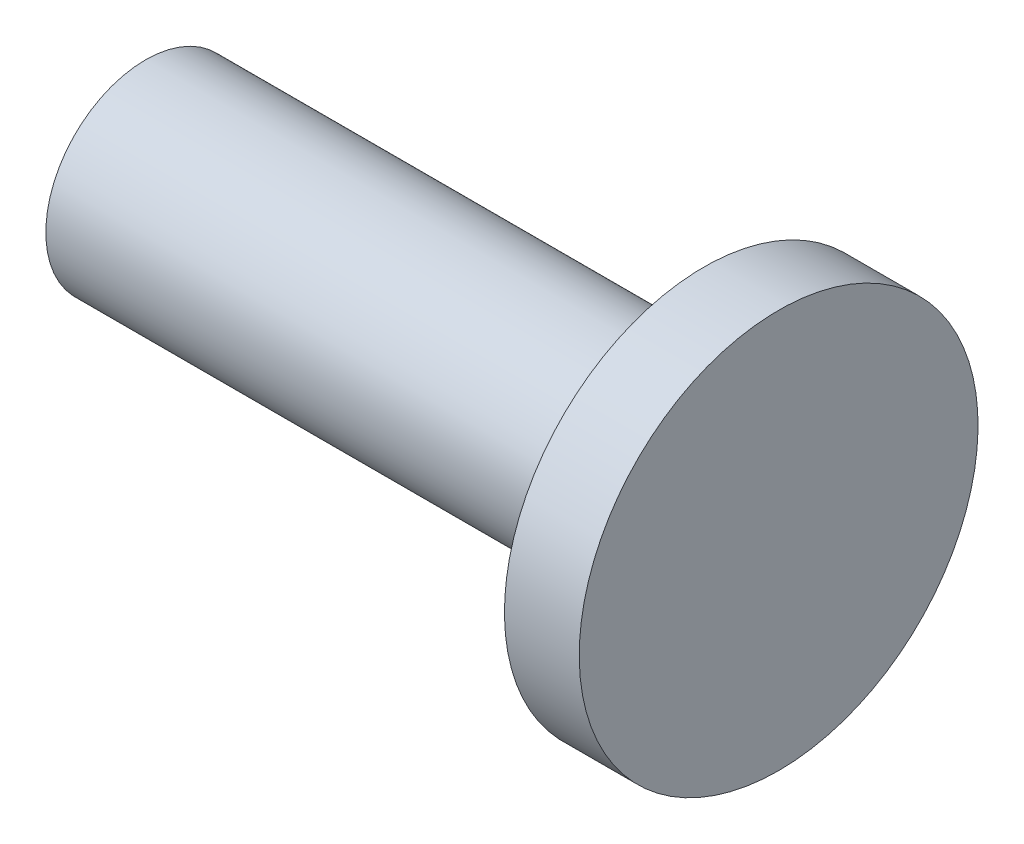
ISO-10303-21;
HEADER;
FILE_DESCRIPTION(('STEP AP214'),'2;1');
FILE_NAME('part.step','',(''),(''),'','','');
FILE_SCHEMA(('AUTOMOTIVE_DESIGN { 1 0 10303 214 1 1 1 1 }'));
ENDSEC;
DATA;
#1=APPLICATION_CONTEXT('core data for automotive mechanical design processes');
#2=APPLICATION_PROTOCOL_DEFINITION('international standard','automotive_design',2000,#1);
#3=PRODUCT_CONTEXT('',#1,'mechanical');
#4=PRODUCT('Part','Part','',(#3));
#5=PRODUCT_RELATED_PRODUCT_CATEGORY('part','',(#4));
#6=PRODUCT_DEFINITION_FORMATION('','',#4);
#7=PRODUCT_DEFINITION_CONTEXT('part definition',#1,'design');
#8=PRODUCT_DEFINITION('design','',#6,#7);
#9=PRODUCT_DEFINITION_SHAPE('','',#8);
#10=(LENGTH_UNIT() NAMED_UNIT(*) SI_UNIT(.MILLI.,.METRE.));
#11=(NAMED_UNIT(*) PLANE_ANGLE_UNIT() SI_UNIT($,.RADIAN.));
#12=(NAMED_UNIT(*) SI_UNIT($,.STERADIAN.) SOLID_ANGLE_UNIT());
#13=UNCERTAINTY_MEASURE_WITH_UNIT(LENGTH_MEASURE(1.E-05),#10,'distance_accuracy_value','');
#14=(GEOMETRIC_REPRESENTATION_CONTEXT(3) GLOBAL_UNCERTAINTY_ASSIGNED_CONTEXT((#13)) GLOBAL_UNIT_ASSIGNED_CONTEXT((#10,
#11,#12)) REPRESENTATION_CONTEXT('',''));
#15=CARTESIAN_POINT('',(0.,0.,0.));
#16=DIRECTION('',(0.,0.,1.));
#17=DIRECTION('',(1.,0.,0.));
#18=AXIS2_PLACEMENT_3D('',#15,#16,#17);
#19=CARTESIAN_POINT('',(-56.,0.,0.));
#20=DIRECTION('',(1.,0.,0.));
#21=DIRECTION('',(0.,1.,0.));
#22=AXIS2_PLACEMENT_3D('',#19,#20,#21);
#23=PLANE('',#22);
#24=CARTESIAN_POINT('',(-56.,0.,0.));
#25=DIRECTION('',(-1.,0.,0.));
#26=DIRECTION('',(0.,-1.,0.));
#27=AXIS2_PLACEMENT_3D('',#24,#25,#26);
#28=CIRCLE('',#27,10.);
#29=CARTESIAN_POINT('',(-56.,-10.,0.));
#30=VERTEX_POINT('',#29);
#31=EDGE_CURVE('E10',#30,#30,#28,.T.);
#32=ORIENTED_EDGE('',*,*,#31,.T.);
#33=EDGE_LOOP('',(#32));
#34=FACE_BOUND('',#33,.T.);
#35=ADVANCED_FACE('F31',(#34),#23,.F.);
#36=CARTESIAN_POINT('',(-72.4500467978421,0.,0.));
#37=DIRECTION('',(-1.,0.,0.));
#38=DIRECTION('',(0.,-1.,0.));
#39=AXIS2_PLACEMENT_3D('',#36,#37,#38);
#40=CYLINDRICAL_SURFACE('',#39,10.);
#41=ORIENTED_EDGE('',*,*,#31,.F.);
#42=EDGE_LOOP('',(#41));
#43=FACE_BOUND('',#42,.T.);
#44=CARTESIAN_POINT('',(0.,0.,0.));
#45=DIRECTION('',(-1.,0.,0.));
#46=DIRECTION('',(0.,-1.,0.));
#47=AXIS2_PLACEMENT_3D('',#44,#45,#46);
#48=CIRCLE('',#47,10.);
#49=CARTESIAN_POINT('',(0.,-10.,0.));
#50=VERTEX_POINT('',#49);
#51=EDGE_CURVE('E37',#50,#50,#48,.T.);
#52=ORIENTED_EDGE('',*,*,#51,.T.);
#53=EDGE_LOOP('',(#52));
#54=FACE_BOUND('',#53,.T.);
#55=ADVANCED_FACE('F63',(#43,#54),#40,.T.);
#56=CARTESIAN_POINT('',(0.,10.,0.));
#57=DIRECTION('',(1.,0.,0.));
#58=DIRECTION('',(0.,1.,0.));
#59=AXIS2_PLACEMENT_3D('',#56,#57,#58);
#60=PLANE('',#59);
#61=ORIENTED_EDGE('',*,*,#51,.F.);
#62=EDGE_LOOP('',(#61));
#63=FACE_BOUND('',#62,.T.);
#64=CARTESIAN_POINT('',(0.,0.,0.));
#65=DIRECTION('',(-1.,0.,0.));
#66=DIRECTION('',(0.,-1.,0.));
#67=AXIS2_PLACEMENT_3D('',#64,#65,#66);
#68=CIRCLE('',#67,20.);
#69=CARTESIAN_POINT('',(0.,-20.,0.));
#70=VERTEX_POINT('',#69);
#71=EDGE_CURVE('E41',#70,#70,#68,.T.);
#72=ORIENTED_EDGE('',*,*,#71,.T.);
#73=EDGE_LOOP('',(#72));
#74=FACE_BOUND('',#73,.T.);
#75=ADVANCED_FACE('F59',(#63,#74),#60,.F.);
#76=CARTESIAN_POINT('',(-72.4500467978421,0.,0.));
#77=DIRECTION('',(-1.,0.,0.));
#78=DIRECTION('',(0.,-1.,0.));
#79=AXIS2_PLACEMENT_3D('',#76,#77,#78);
#80=CYLINDRICAL_SURFACE('',#79,20.);
#81=ORIENTED_EDGE('',*,*,#71,.F.);
#82=EDGE_LOOP('',(#81));
#83=FACE_BOUND('',#82,.T.);
#84=CARTESIAN_POINT('',(7.50000000000001,0.,0.));
#85=DIRECTION('',(-1.,0.,0.));
#86=DIRECTION('',(0.,-1.,0.));
#87=AXIS2_PLACEMENT_3D('',#84,#85,#86);
#88=CIRCLE('',#87,20.);
#89=CARTESIAN_POINT('',(7.50000000000001,-20.,0.));
#90=VERTEX_POINT('',#89);
#91=EDGE_CURVE('E45',#90,#90,#88,.T.);
#92=ORIENTED_EDGE('',*,*,#91,.T.);
#93=EDGE_LOOP('',(#92));
#94=FACE_BOUND('',#93,.T.);
#95=ADVANCED_FACE('F51',(#83,#94),#80,.T.);
#96=CARTESIAN_POINT('',(7.5,20.,0.));
#97=DIRECTION('',(-1.,0.,0.));
#98=DIRECTION('',(0.,-1.,0.));
#99=AXIS2_PLACEMENT_3D('',#96,#97,#98);
#100=PLANE('',#99);
#101=ORIENTED_EDGE('',*,*,#91,.F.);
#102=EDGE_LOOP('',(#101));
#103=FACE_BOUND('',#102,.T.);
#104=ADVANCED_FACE('F53',(#103),#100,.F.);
#105=CLOSED_SHELL('',(#35,#55,#75,#95,#104));
#106=MANIFOLD_SOLID_BREP('B2',#105);
#107=ADVANCED_BREP_SHAPE_REPRESENTATION('',(#18,#106),#14);
#108=SHAPE_DEFINITION_REPRESENTATION(#9,#107);
ENDSEC;
END-ISO-10303-21;
